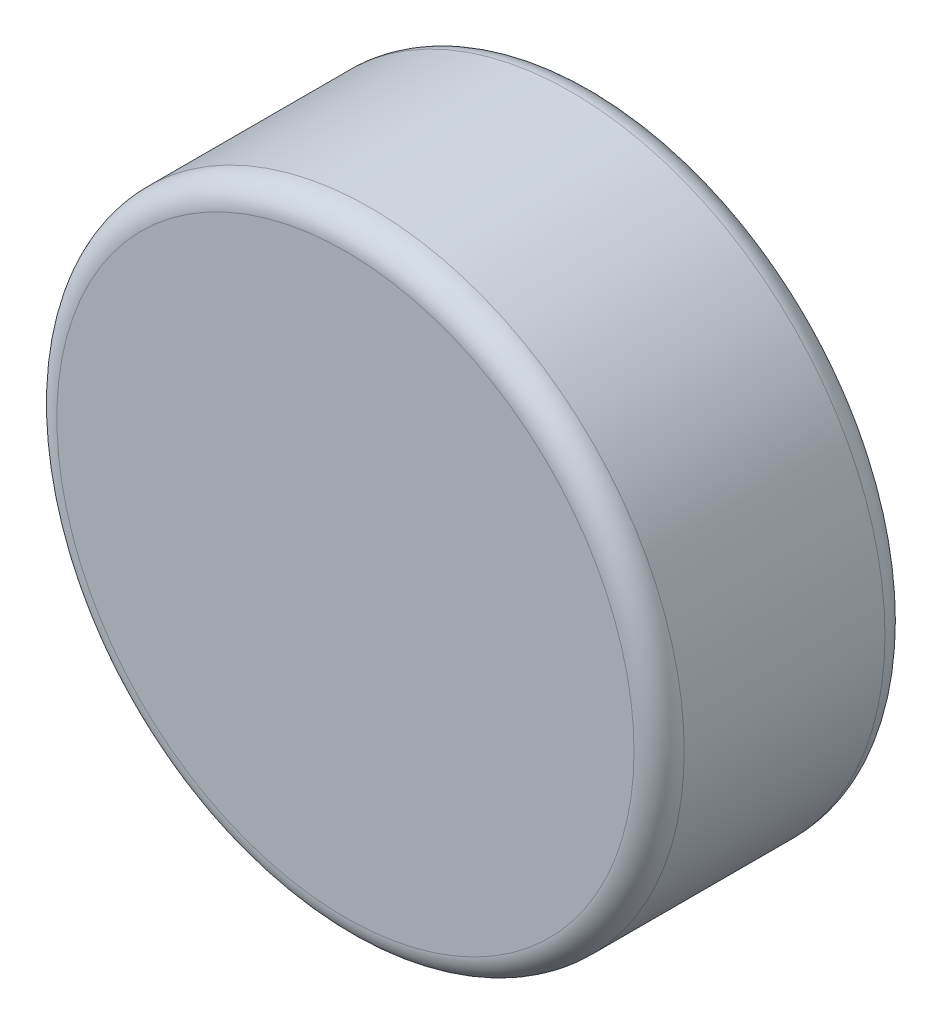
ISO-10303-21;
HEADER;
FILE_DESCRIPTION(('STEP AP214'),'2;1');
FILE_NAME('part.step','',(''),(''),'','','');
FILE_SCHEMA(('AUTOMOTIVE_DESIGN { 1 0 10303 214 1 1 1 1 }'));
ENDSEC;
DATA;
#1=APPLICATION_CONTEXT('core data for automotive mechanical design processes');
#2=APPLICATION_PROTOCOL_DEFINITION('international standard','automotive_design',2000,#1);
#3=PRODUCT_CONTEXT('',#1,'mechanical');
#4=PRODUCT('Part','Part','',(#3));
#5=PRODUCT_RELATED_PRODUCT_CATEGORY('part','',(#4));
#6=PRODUCT_DEFINITION_FORMATION('','',#4);
#7=PRODUCT_DEFINITION_CONTEXT('part definition',#1,'design');
#8=PRODUCT_DEFINITION('design','',#6,#7);
#9=PRODUCT_DEFINITION_SHAPE('','',#8);
#10=(LENGTH_UNIT() NAMED_UNIT(*) SI_UNIT(.MILLI.,.METRE.));
#11=(NAMED_UNIT(*) PLANE_ANGLE_UNIT() SI_UNIT($,.RADIAN.));
#12=(NAMED_UNIT(*) SI_UNIT($,.STERADIAN.) SOLID_ANGLE_UNIT());
#13=UNCERTAINTY_MEASURE_WITH_UNIT(LENGTH_MEASURE(1.E-05),#10,'distance_accuracy_value','');
#14=(GEOMETRIC_REPRESENTATION_CONTEXT(3) GLOBAL_UNCERTAINTY_ASSIGNED_CONTEXT((#13)) GLOBAL_UNIT_ASSIGNED_CONTEXT((#10,
#11,#12)) REPRESENTATION_CONTEXT('',''));
#15=CARTESIAN_POINT('',(0.,0.,0.));
#16=DIRECTION('',(0.,0.,1.));
#17=DIRECTION('',(1.,0.,0.));
#18=AXIS2_PLACEMENT_3D('',#15,#16,#17);
#19=CARTESIAN_POINT('',(0.,0.,2.54));
#20=DIRECTION('',(0.,0.,-1.));
#21=DIRECTION('',(-1.,0.,0.));
#22=AXIS2_PLACEMENT_3D('',#19,#20,#21);
#23=CYLINDRICAL_SURFACE('',#22,3.175);
#24=CARTESIAN_POINT('',(0.,0.,2.286));
#25=DIRECTION('',(0.,0.,1.));
#26=DIRECTION('',(1.,0.,0.));
#27=AXIS2_PLACEMENT_3D('',#24,#25,#26);
#28=CIRCLE('',#27,3.175);
#29=CARTESIAN_POINT('',(3.175,0.,2.286));
#30=VERTEX_POINT('',#29);
#31=EDGE_CURVE('E10',#30,#30,#28,.F.);
#32=ORIENTED_EDGE('',*,*,#31,.T.);
#33=EDGE_LOOP('',(#32));
#34=FACE_BOUND('',#33,.T.);
#35=CARTESIAN_POINT('',(0.,0.,0.254));
#36=DIRECTION('',(0.,0.,1.));
#37=DIRECTION('',(1.,0.,0.));
#38=AXIS2_PLACEMENT_3D('',#35,#36,#37);
#39=CIRCLE('',#38,3.175);
#40=CARTESIAN_POINT('',(3.175,0.,0.254));
#41=VERTEX_POINT('',#40);
#42=EDGE_CURVE('E55',#41,#41,#39,.T.);
#43=ORIENTED_EDGE('',*,*,#42,.T.);
#44=EDGE_LOOP('',(#43));
#45=FACE_BOUND('',#44,.T.);
#46=ADVANCED_FACE('F37',(#34,#45),#23,.T.);
#47=CARTESIAN_POINT('',(0.,0.,2.54));
#48=DIRECTION('',(0.,0.,1.));
#49=DIRECTION('',(1.,0.,0.));
#50=AXIS2_PLACEMENT_3D('',#47,#48,#49);
#51=PLANE('',#50);
#52=CARTESIAN_POINT('',(0.,0.,2.54));
#53=DIRECTION('',(0.,0.,1.));
#54=DIRECTION('',(1.,0.,0.));
#55=AXIS2_PLACEMENT_3D('',#52,#53,#54);
#56=CIRCLE('',#55,2.921);
#57=CARTESIAN_POINT('',(2.921,0.,2.54));
#58=VERTEX_POINT('',#57);
#59=EDGE_CURVE('E45',#58,#58,#56,.T.);
#60=ORIENTED_EDGE('',*,*,#59,.T.);
#61=EDGE_LOOP('',(#60));
#62=FACE_BOUND('',#61,.T.);
#63=ADVANCED_FACE('F72',(#62),#51,.T.);
#64=CARTESIAN_POINT('',(0.,0.,0.));
#65=DIRECTION('',(0.,0.,1.));
#66=DIRECTION('',(1.,0.,0.));
#67=AXIS2_PLACEMENT_3D('',#64,#65,#66);
#68=PLANE('',#67);
#69=CARTESIAN_POINT('',(0.,0.,0.));
#70=DIRECTION('',(0.,0.,1.));
#71=DIRECTION('',(1.,0.,0.));
#72=AXIS2_PLACEMENT_3D('',#69,#70,#71);
#73=CIRCLE('',#72,2.921);
#74=CARTESIAN_POINT('',(2.921,0.,0.));
#75=VERTEX_POINT('',#74);
#76=EDGE_CURVE('E50',#75,#75,#73,.F.);
#77=ORIENTED_EDGE('',*,*,#76,.T.);
#78=EDGE_LOOP('',(#77));
#79=FACE_BOUND('',#78,.T.);
#80=ADVANCED_FACE('F65',(#79),#68,.F.);
#81=CARTESIAN_POINT('',(0.,0.,0.254));
#82=DIRECTION('',(0.,0.,1.));
#83=DIRECTION('',(1.,0.,0.));
#84=AXIS2_PLACEMENT_3D('',#81,#82,#83);
#85=TOROIDAL_SURFACE('',#84,2.921,0.254);
#86=ORIENTED_EDGE('',*,*,#76,.F.);
#87=EDGE_LOOP('',(#86));
#88=FACE_BOUND('',#87,.T.);
#89=ORIENTED_EDGE('',*,*,#42,.F.);
#90=EDGE_LOOP('',(#89));
#91=FACE_BOUND('',#90,.T.);
#92=ADVANCED_FACE('F63',(#88,#91),#85,.T.);
#93=CARTESIAN_POINT('',(0.,0.,2.286));
#94=DIRECTION('',(0.,0.,1.));
#95=DIRECTION('',(1.,0.,0.));
#96=AXIS2_PLACEMENT_3D('',#93,#94,#95);
#97=TOROIDAL_SURFACE('',#96,2.921,0.254);
#98=ORIENTED_EDGE('',*,*,#31,.F.);
#99=EDGE_LOOP('',(#98));
#100=FACE_BOUND('',#99,.T.);
#101=ORIENTED_EDGE('',*,*,#59,.F.);
#102=EDGE_LOOP('',(#101));
#103=FACE_BOUND('',#102,.T.);
#104=ADVANCED_FACE('F39',(#100,#103),#97,.T.);
#105=CLOSED_SHELL('',(#46,#63,#80,#92,#104));
#106=MANIFOLD_SOLID_BREP('B2',#105);
#107=ADVANCED_BREP_SHAPE_REPRESENTATION('',(#18,#106),#14);
#108=SHAPE_DEFINITION_REPRESENTATION(#9,#107);
ENDSEC;
END-ISO-10303-21;
